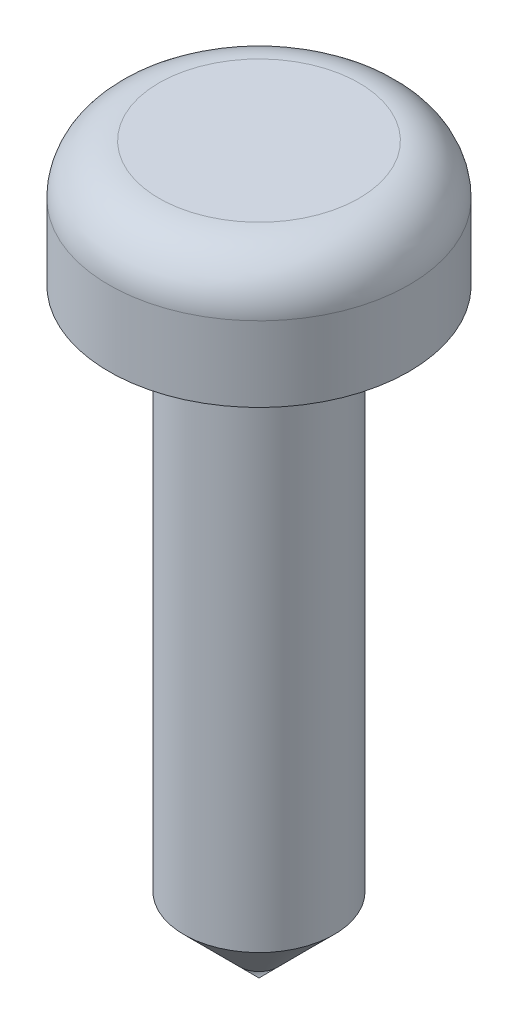
ISO-10303-21;
HEADER;
FILE_DESCRIPTION(('STEP AP214'),'2;1');
FILE_NAME('part.step','',(''),(''),'','','');
FILE_SCHEMA(('AUTOMOTIVE_DESIGN { 1 0 10303 214 1 1 1 1 }'));
ENDSEC;
DATA;
#1=APPLICATION_CONTEXT('core data for automotive mechanical design processes');
#2=APPLICATION_PROTOCOL_DEFINITION('international standard','automotive_design',2000,#1);
#3=PRODUCT_CONTEXT('',#1,'mechanical');
#4=PRODUCT('Part','Part','',(#3));
#5=PRODUCT_RELATED_PRODUCT_CATEGORY('part','',(#4));
#6=PRODUCT_DEFINITION_FORMATION('','',#4);
#7=PRODUCT_DEFINITION_CONTEXT('part definition',#1,'design');
#8=PRODUCT_DEFINITION('design','',#6,#7);
#9=PRODUCT_DEFINITION_SHAPE('','',#8);
#10=(LENGTH_UNIT() NAMED_UNIT(*) SI_UNIT(.MILLI.,.METRE.));
#11=(NAMED_UNIT(*) PLANE_ANGLE_UNIT() SI_UNIT($,.RADIAN.));
#12=(NAMED_UNIT(*) SI_UNIT($,.STERADIAN.) SOLID_ANGLE_UNIT());
#13=UNCERTAINTY_MEASURE_WITH_UNIT(LENGTH_MEASURE(1.E-05),#10,'distance_accuracy_value','');
#14=(GEOMETRIC_REPRESENTATION_CONTEXT(3) GLOBAL_UNCERTAINTY_ASSIGNED_CONTEXT((#13)) GLOBAL_UNIT_ASSIGNED_CONTEXT((#10,
#11,#12)) REPRESENTATION_CONTEXT('',''));
#15=CARTESIAN_POINT('',(0.,0.,0.));
#16=DIRECTION('',(0.,0.,1.));
#17=DIRECTION('',(1.,0.,0.));
#18=AXIS2_PLACEMENT_3D('',#15,#16,#17);
#19=CARTESIAN_POINT('',(0.,14.5,0.));
#20=DIRECTION('',(0.,-1.,0.));
#21=DIRECTION('',(1.,0.,0.));
#22=AXIS2_PLACEMENT_3D('',#19,#20,#21);
#23=PLANE('',#22);
#24=CARTESIAN_POINT('',(0.,14.5,0.));
#25=DIRECTION('',(0.,-1.,0.));
#26=DIRECTION('',(1.,0.,0.));
#27=AXIS2_PLACEMENT_3D('',#24,#25,#26);
#28=CIRCLE('',#27,2.);
#29=CARTESIAN_POINT('',(2.,14.5,0.));
#30=VERTEX_POINT('',#29);
#31=EDGE_CURVE('E41',#30,#30,#28,.F.);
#32=ORIENTED_EDGE('',*,*,#31,.T.);
#33=EDGE_LOOP('',(#32));
#34=FACE_BOUND('',#33,.T.);
#35=ADVANCED_FACE('F34',(#34),#23,.F.);
#36=CARTESIAN_POINT('',(0.,14.5,0.));
#37=DIRECTION('',(0.,1.,0.));
#38=DIRECTION('',(-1.,0.,0.));
#39=AXIS2_PLACEMENT_3D('',#36,#37,#38);
#40=CYLINDRICAL_SURFACE('',#39,3.);
#41=CARTESIAN_POINT('',(0.,13.5,0.));
#42=DIRECTION('',(0.,-1.,0.));
#43=DIRECTION('',(1.,0.,0.));
#44=AXIS2_PLACEMENT_3D('',#41,#42,#43);
#45=CIRCLE('',#44,3.);
#46=CARTESIAN_POINT('',(3.,13.5,0.));
#47=VERTEX_POINT('',#46);
#48=EDGE_CURVE('E11',#47,#47,#45,.T.);
#49=ORIENTED_EDGE('',*,*,#48,.T.);
#50=EDGE_LOOP('',(#49));
#51=FACE_BOUND('',#50,.T.);
#52=CARTESIAN_POINT('',(0.,12.,0.));
#53=DIRECTION('',(0.,1.,0.));
#54=DIRECTION('',(-1.,0.,0.));
#55=AXIS2_PLACEMENT_3D('',#52,#53,#54);
#56=CIRCLE('',#55,3.);
#57=CARTESIAN_POINT('',(-3.,12.,0.));
#58=VERTEX_POINT('',#57);
#59=EDGE_CURVE('E75',#58,#58,#56,.T.);
#60=ORIENTED_EDGE('',*,*,#59,.T.);
#61=EDGE_LOOP('',(#60));
#62=FACE_BOUND('',#61,.T.);
#63=ADVANCED_FACE('F59',(#51,#62),#40,.T.);
#64=CARTESIAN_POINT('',(3.,12.,0.));
#65=DIRECTION('',(0.,1.,0.));
#66=DIRECTION('',(-1.,0.,0.));
#67=AXIS2_PLACEMENT_3D('',#64,#65,#66);
#68=PLANE('',#67);
#69=ORIENTED_EDGE('',*,*,#59,.F.);
#70=EDGE_LOOP('',(#69));
#71=FACE_BOUND('',#70,.T.);
#72=CARTESIAN_POINT('',(0.,12.,0.));
#73=DIRECTION('',(0.,1.,0.));
#74=DIRECTION('',(-1.,0.,0.));
#75=AXIS2_PLACEMENT_3D('',#72,#73,#74);
#76=CIRCLE('',#75,1.5);
#77=CARTESIAN_POINT('',(-1.5,12.,0.));
#78=VERTEX_POINT('',#77);
#79=EDGE_CURVE('E78',#78,#78,#76,.T.);
#80=ORIENTED_EDGE('',*,*,#79,.T.);
#81=EDGE_LOOP('',(#80));
#82=FACE_BOUND('',#81,.T.);
#83=ADVANCED_FACE('F54',(#71,#82),#68,.F.);
#84=CARTESIAN_POINT('',(0.,14.5,0.));
#85=DIRECTION('',(0.,1.,0.));
#86=DIRECTION('',(-1.,0.,0.));
#87=AXIS2_PLACEMENT_3D('',#84,#85,#86);
#88=CYLINDRICAL_SURFACE('',#87,1.5);
#89=ORIENTED_EDGE('',*,*,#79,.F.);
#90=EDGE_LOOP('',(#89));
#91=FACE_BOUND('',#90,.T.);
#92=CARTESIAN_POINT('',(0.,1.5,0.));
#93=DIRECTION('',(0.,1.,0.));
#94=DIRECTION('',(-1.,0.,0.));
#95=AXIS2_PLACEMENT_3D('',#92,#93,#94);
#96=CIRCLE('',#95,1.5);
#97=CARTESIAN_POINT('',(-1.5,1.5,0.));
#98=VERTEX_POINT('',#97);
#99=EDGE_CURVE('E79',#98,#98,#96,.T.);
#100=ORIENTED_EDGE('',*,*,#99,.T.);
#101=EDGE_LOOP('',(#100));
#102=FACE_BOUND('',#101,.T.);
#103=ADVANCED_FACE('F46',(#91,#102),#88,.T.);
#104=CARTESIAN_POINT('',(0.,0.,0.));
#105=DIRECTION('',(0.,1.,0.));
#106=DIRECTION('',(-1.,0.,0.));
#107=AXIS2_PLACEMENT_3D('',#104,#105,#106);
#108=CONICAL_SURFACE('',#107,0.,0.78539816339745);
#109=ORIENTED_EDGE('',*,*,#99,.F.);
#110=EDGE_LOOP('',(#109));
#111=FACE_BOUND('',#110,.T.);
#112=CARTESIAN_POINT('',(0.,0.,0.));
#113=VERTEX_POINT('',#112);
#114=VERTEX_LOOP('',#113);
#115=FACE_BOUND('',#114,.T.);
#116=ADVANCED_FACE('F44',(#111,#115),#108,.T.);
#117=CARTESIAN_POINT('',(0.,13.5,0.));
#118=DIRECTION('',(0.,-1.,0.));
#119=DIRECTION('',(1.,0.,0.));
#120=AXIS2_PLACEMENT_3D('',#117,#118,#119);
#121=TOROIDAL_SURFACE('',#120,2.,1.);
#122=ORIENTED_EDGE('',*,*,#48,.F.);
#123=EDGE_LOOP('',(#122));
#124=FACE_BOUND('',#123,.T.);
#125=ORIENTED_EDGE('',*,*,#31,.F.);
#126=EDGE_LOOP('',(#125));
#127=FACE_BOUND('',#126,.T.);
#128=ADVANCED_FACE('F36',(#124,#127),#121,.T.);
#129=CLOSED_SHELL('',(#35,#63,#83,#103,#116,#128));
#130=MANIFOLD_SOLID_BREP('B2',#129);
#131=ADVANCED_BREP_SHAPE_REPRESENTATION('',(#18,#130),#14);
#132=SHAPE_DEFINITION_REPRESENTATION(#9,#131);
ENDSEC;
END-ISO-10303-21;
